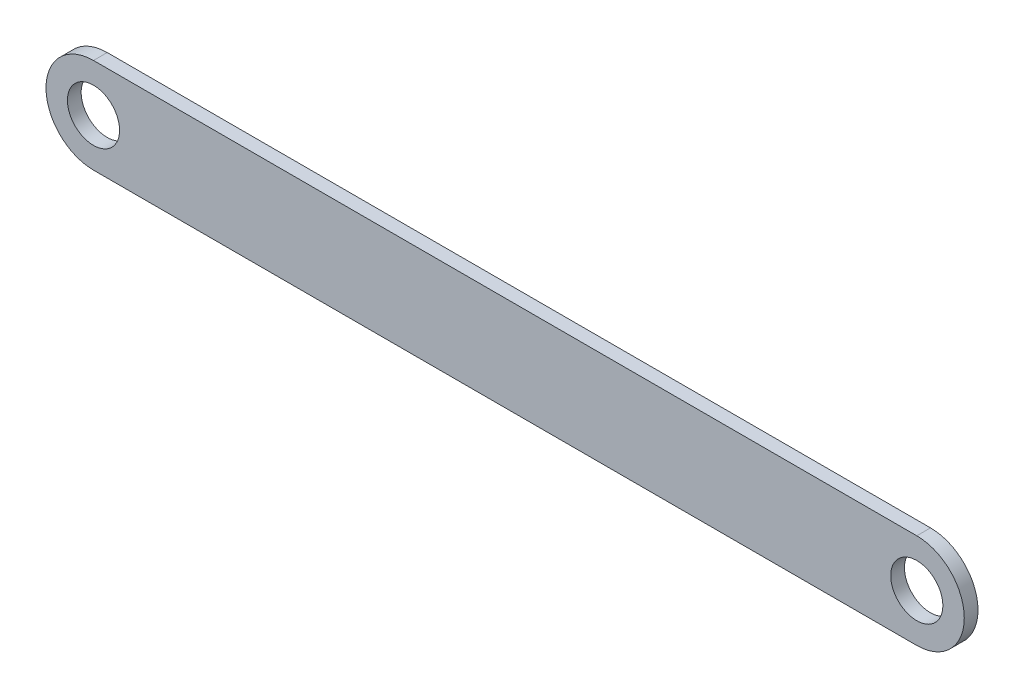
ISO-10303-21;
HEADER;
FILE_DESCRIPTION(('STEP AP214'),'2;1');
FILE_NAME('part.step','',(''),(''),'','','');
FILE_SCHEMA(('AUTOMOTIVE_DESIGN { 1 0 10303 214 1 1 1 1 }'));
ENDSEC;
DATA;
#1=APPLICATION_CONTEXT('core data for automotive mechanical design processes');
#2=APPLICATION_PROTOCOL_DEFINITION('international standard','automotive_design',2000,#1);
#3=PRODUCT_CONTEXT('',#1,'mechanical');
#4=PRODUCT('Part','Part','',(#3));
#5=PRODUCT_RELATED_PRODUCT_CATEGORY('part','',(#4));
#6=PRODUCT_DEFINITION_FORMATION('','',#4);
#7=PRODUCT_DEFINITION_CONTEXT('part definition',#1,'design');
#8=PRODUCT_DEFINITION('design','',#6,#7);
#9=PRODUCT_DEFINITION_SHAPE('','',#8);
#10=(LENGTH_UNIT() NAMED_UNIT(*) SI_UNIT(.MILLI.,.METRE.));
#11=(NAMED_UNIT(*) PLANE_ANGLE_UNIT() SI_UNIT($,.RADIAN.));
#12=(NAMED_UNIT(*) SI_UNIT($,.STERADIAN.) SOLID_ANGLE_UNIT());
#13=UNCERTAINTY_MEASURE_WITH_UNIT(LENGTH_MEASURE(1.E-05),#10,'distance_accuracy_value','');
#14=(GEOMETRIC_REPRESENTATION_CONTEXT(3) GLOBAL_UNCERTAINTY_ASSIGNED_CONTEXT((#13)) GLOBAL_UNIT_ASSIGNED_CONTEXT((#10,
#11,#12)) REPRESENTATION_CONTEXT('',''));
#15=CARTESIAN_POINT('',(0.,0.,0.));
#16=DIRECTION('',(0.,0.,1.));
#17=DIRECTION('',(1.,0.,0.));
#18=AXIS2_PLACEMENT_3D('',#15,#16,#17);
#19=CARTESIAN_POINT('',(-75.,0.,2.5));
#20=DIRECTION('',(0.,0.,-1.));
#21=DIRECTION('',(-1.,0.,0.));
#22=AXIS2_PLACEMENT_3D('',#19,#20,#21);
#23=CYLINDRICAL_SURFACE('',#22,8.65384615384615);
#24=CARTESIAN_POINT('',(-75.,0.,0.));
#25=DIRECTION('',(0.,0.,1.));
#26=DIRECTION('',(1.,0.,0.));
#27=AXIS2_PLACEMENT_3D('',#24,#25,#26);
#28=CIRCLE('',#27,8.65384615384615);
#29=CARTESIAN_POINT('',(-75.,8.65384615384615,0.));
#30=VERTEX_POINT('',#29);
#31=CARTESIAN_POINT('',(-75.,-8.65384615384615,0.));
#32=VERTEX_POINT('',#31);
#33=EDGE_CURVE('E107',#30,#32,#28,.T.);
#34=ORIENTED_EDGE('',*,*,#33,.T.);
#35=DIRECTION('',(0.,0.,-1.));
#36=VECTOR('',#35,1.);
#37=CARTESIAN_POINT('',(-75.,-8.65384615384615,2.5));
#38=LINE('',#37,#36);
#39=CARTESIAN_POINT('',(-75.,-8.65384615384615,2.5));
#40=VERTEX_POINT('',#39);
#41=EDGE_CURVE('E11',#40,#32,#38,.T.);
#42=ORIENTED_EDGE('',*,*,#41,.F.);
#43=CARTESIAN_POINT('',(-75.,0.,2.5));
#44=DIRECTION('',(0.,0.,1.));
#45=DIRECTION('',(1.,0.,0.));
#46=AXIS2_PLACEMENT_3D('',#43,#44,#45);
#47=CIRCLE('',#46,8.65384615384615);
#48=CARTESIAN_POINT('',(-75.,8.65384615384615,2.5));
#49=VERTEX_POINT('',#48);
#50=EDGE_CURVE('E91',#49,#40,#47,.T.);
#51=ORIENTED_EDGE('',*,*,#50,.F.);
#52=DIRECTION('',(0.,0.,-1.));
#53=VECTOR('',#52,1.);
#54=CARTESIAN_POINT('',(-75.,8.65384615384615,2.5));
#55=LINE('',#54,#53);
#56=EDGE_CURVE('E103',#49,#30,#55,.T.);
#57=ORIENTED_EDGE('',*,*,#56,.T.);
#58=EDGE_LOOP('',(#34,#42,#51,#57));
#59=FACE_BOUND('',#58,.T.);
#60=ADVANCED_FACE('F39',(#59),#23,.T.);
#61=CARTESIAN_POINT('',(-75.,-8.65384615384615,2.5));
#62=DIRECTION('',(0.,1.,0.));
#63=DIRECTION('',(-1.,0.,0.));
#64=AXIS2_PLACEMENT_3D('',#61,#62,#63);
#65=PLANE('',#64);
#66=DIRECTION('',(1.,0.,0.));
#67=VECTOR('',#66,1.);
#68=CARTESIAN_POINT('',(-75.,-8.65384615384615,0.));
#69=LINE('',#68,#67);
#70=CARTESIAN_POINT('',(75.,-8.65384615384612,0.));
#71=VERTEX_POINT('',#70);
#72=EDGE_CURVE('E96',#32,#71,#69,.T.);
#73=ORIENTED_EDGE('',*,*,#72,.T.);
#74=DIRECTION('',(0.,0.,-1.));
#75=VECTOR('',#74,1.);
#76=CARTESIAN_POINT('',(75.,-8.65384615384612,2.5));
#77=LINE('',#76,#75);
#78=CARTESIAN_POINT('',(75.,-8.65384615384612,2.5));
#79=VERTEX_POINT('',#78);
#80=EDGE_CURVE('E48',#79,#71,#77,.T.);
#81=ORIENTED_EDGE('',*,*,#80,.F.);
#82=DIRECTION('',(1.,0.,0.));
#83=VECTOR('',#82,1.);
#84=CARTESIAN_POINT('',(-75.,-8.65384615384615,2.5));
#85=LINE('',#84,#83);
#86=EDGE_CURVE('E86',#40,#79,#85,.T.);
#87=ORIENTED_EDGE('',*,*,#86,.F.);
#88=ORIENTED_EDGE('',*,*,#41,.T.);
#89=EDGE_LOOP('',(#73,#81,#87,#88));
#90=FACE_BOUND('',#89,.T.);
#91=ADVANCED_FACE('F95',(#90),#65,.F.);
#92=CARTESIAN_POINT('',(75.,0.,2.5));
#93=DIRECTION('',(0.,0.,-1.));
#94=DIRECTION('',(-1.,0.,0.));
#95=AXIS2_PLACEMENT_3D('',#92,#93,#94);
#96=CYLINDRICAL_SURFACE('',#95,8.65384615384615);
#97=CARTESIAN_POINT('',(75.,0.,0.));
#98=DIRECTION('',(0.,0.,1.));
#99=DIRECTION('',(1.,0.,0.));
#100=AXIS2_PLACEMENT_3D('',#97,#98,#99);
#101=CIRCLE('',#100,8.65384615384615);
#102=CARTESIAN_POINT('',(75.,8.65384615384618,0.));
#103=VERTEX_POINT('',#102);
#104=EDGE_CURVE('E73',#71,#103,#101,.T.);
#105=ORIENTED_EDGE('',*,*,#104,.T.);
#106=DIRECTION('',(0.,0.,-1.));
#107=VECTOR('',#106,1.);
#108=CARTESIAN_POINT('',(75.,8.65384615384618,2.5));
#109=LINE('',#108,#107);
#110=CARTESIAN_POINT('',(75.,8.65384615384618,2.5));
#111=VERTEX_POINT('',#110);
#112=EDGE_CURVE('E98',#111,#103,#109,.T.);
#113=ORIENTED_EDGE('',*,*,#112,.F.);
#114=CARTESIAN_POINT('',(75.,0.,2.5));
#115=DIRECTION('',(0.,0.,1.));
#116=DIRECTION('',(1.,0.,0.));
#117=AXIS2_PLACEMENT_3D('',#114,#115,#116);
#118=CIRCLE('',#117,8.65384615384615);
#119=EDGE_CURVE('E89',#79,#111,#118,.T.);
#120=ORIENTED_EDGE('',*,*,#119,.F.);
#121=ORIENTED_EDGE('',*,*,#80,.T.);
#122=EDGE_LOOP('',(#105,#113,#120,#121));
#123=FACE_BOUND('',#122,.T.);
#124=ADVANCED_FACE('F99',(#123),#96,.T.);
#125=CARTESIAN_POINT('',(-75.,8.65384615384615,2.5));
#126=DIRECTION('',(0.,-1.,0.));
#127=DIRECTION('',(1.,0.,0.));
#128=AXIS2_PLACEMENT_3D('',#125,#126,#127);
#129=PLANE('',#128);
#130=DIRECTION('',(-1.,0.,0.));
#131=VECTOR('',#130,1.);
#132=CARTESIAN_POINT('',(-75.,8.65384615384615,0.));
#133=LINE('',#132,#131);
#134=EDGE_CURVE('E79',#103,#30,#133,.T.);
#135=ORIENTED_EDGE('',*,*,#134,.T.);
#136=ORIENTED_EDGE('',*,*,#56,.F.);
#137=DIRECTION('',(-1.,0.,0.));
#138=VECTOR('',#137,1.);
#139=CARTESIAN_POINT('',(-75.,8.65384615384615,2.5));
#140=LINE('',#139,#138);
#141=EDGE_CURVE('E56',#111,#49,#140,.T.);
#142=ORIENTED_EDGE('',*,*,#141,.F.);
#143=ORIENTED_EDGE('',*,*,#112,.T.);
#144=EDGE_LOOP('',(#135,#136,#142,#143));
#145=FACE_BOUND('',#144,.T.);
#146=ADVANCED_FACE('F121',(#145),#129,.F.);
#147=CARTESIAN_POINT('',(-75.,0.,2.5));
#148=DIRECTION('',(0.,0.,1.));
#149=DIRECTION('',(1.,0.,0.));
#150=AXIS2_PLACEMENT_3D('',#147,#148,#149);
#151=PLANE('',#150);
#152=CARTESIAN_POINT('',(-75.,0.,2.5));
#153=DIRECTION('',(0.,0.,1.));
#154=DIRECTION('',(1.,0.,0.));
#155=AXIS2_PLACEMENT_3D('',#152,#153,#154);
#156=CIRCLE('',#155,4.75);
#157=CARTESIAN_POINT('',(-70.25,0.,2.5));
#158=VERTEX_POINT('',#157);
#159=EDGE_CURVE('E136',#158,#158,#156,.T.);
#160=ORIENTED_EDGE('',*,*,#159,.F.);
#161=EDGE_LOOP('',(#160));
#162=FACE_BOUND('',#161,.T.);
#163=CARTESIAN_POINT('',(75.,0.,2.5));
#164=DIRECTION('',(0.,0.,1.));
#165=DIRECTION('',(1.,0.,0.));
#166=AXIS2_PLACEMENT_3D('',#163,#164,#165);
#167=CIRCLE('',#166,4.75);
#168=CARTESIAN_POINT('',(79.75,0.,2.5));
#169=VERTEX_POINT('',#168);
#170=EDGE_CURVE('E128',#169,#169,#167,.T.);
#171=ORIENTED_EDGE('',*,*,#170,.F.);
#172=EDGE_LOOP('',(#171));
#173=FACE_BOUND('',#172,.T.);
#174=ORIENTED_EDGE('',*,*,#50,.T.);
#175=ORIENTED_EDGE('',*,*,#86,.T.);
#176=ORIENTED_EDGE('',*,*,#119,.T.);
#177=ORIENTED_EDGE('',*,*,#141,.T.);
#178=EDGE_LOOP('',(#174,#175,#176,#177));
#179=FACE_BOUND('',#178,.T.);
#180=ADVANCED_FACE('F87',(#162,#173,#179),#151,.T.);
#181=CARTESIAN_POINT('',(-75.,0.,0.));
#182=DIRECTION('',(0.,0.,1.));
#183=DIRECTION('',(1.,0.,0.));
#184=AXIS2_PLACEMENT_3D('',#181,#182,#183);
#185=PLANE('',#184);
#186=CARTESIAN_POINT('',(-75.,0.,0.));
#187=DIRECTION('',(0.,0.,1.));
#188=DIRECTION('',(1.,0.,0.));
#189=AXIS2_PLACEMENT_3D('',#186,#187,#188);
#190=CIRCLE('',#189,4.75);
#191=CARTESIAN_POINT('',(-70.25,0.,0.));
#192=VERTEX_POINT('',#191);
#193=EDGE_CURVE('E111',#192,#192,#190,.T.);
#194=ORIENTED_EDGE('',*,*,#193,.T.);
#195=EDGE_LOOP('',(#194));
#196=FACE_BOUND('',#195,.T.);
#197=CARTESIAN_POINT('',(75.,0.,0.));
#198=DIRECTION('',(0.,0.,1.));
#199=DIRECTION('',(1.,0.,0.));
#200=AXIS2_PLACEMENT_3D('',#197,#198,#199);
#201=CIRCLE('',#200,4.75);
#202=CARTESIAN_POINT('',(79.75,0.,0.));
#203=VERTEX_POINT('',#202);
#204=EDGE_CURVE('E132',#203,#203,#201,.T.);
#205=ORIENTED_EDGE('',*,*,#204,.T.);
#206=EDGE_LOOP('',(#205));
#207=FACE_BOUND('',#206,.T.);
#208=ORIENTED_EDGE('',*,*,#33,.F.);
#209=ORIENTED_EDGE('',*,*,#134,.F.);
#210=ORIENTED_EDGE('',*,*,#104,.F.);
#211=ORIENTED_EDGE('',*,*,#72,.F.);
#212=EDGE_LOOP('',(#208,#209,#210,#211));
#213=FACE_BOUND('',#212,.T.);
#214=ADVANCED_FACE('F124',(#196,#207,#213),#185,.F.);
#215=CARTESIAN_POINT('',(75.,0.,0.));
#216=DIRECTION('',(0.,0.,1.));
#217=DIRECTION('',(1.,0.,0.));
#218=AXIS2_PLACEMENT_3D('',#215,#216,#217);
#219=CYLINDRICAL_SURFACE('',#218,4.75);
#220=ORIENTED_EDGE('',*,*,#204,.F.);
#221=EDGE_LOOP('',(#220));
#222=FACE_BOUND('',#221,.T.);
#223=ORIENTED_EDGE('',*,*,#170,.T.);
#224=EDGE_LOOP('',(#223));
#225=FACE_BOUND('',#224,.T.);
#226=ADVANCED_FACE('F149',(#222,#225),#219,.F.);
#227=CARTESIAN_POINT('',(-75.,0.,0.));
#228=DIRECTION('',(0.,0.,1.));
#229=DIRECTION('',(1.,0.,0.));
#230=AXIS2_PLACEMENT_3D('',#227,#228,#229);
#231=CYLINDRICAL_SURFACE('',#230,4.75);
#232=ORIENTED_EDGE('',*,*,#193,.F.);
#233=EDGE_LOOP('',(#232));
#234=FACE_BOUND('',#233,.T.);
#235=ORIENTED_EDGE('',*,*,#159,.T.);
#236=EDGE_LOOP('',(#235));
#237=FACE_BOUND('',#236,.T.);
#238=ADVANCED_FACE('F146',(#234,#237),#231,.F.);
#239=CLOSED_SHELL('',(#60,#91,#124,#146,#180,#214,#226,#238));
#240=MANIFOLD_SOLID_BREP('B2',#239);
#241=ADVANCED_BREP_SHAPE_REPRESENTATION('',(#18,#240),#14);
#242=SHAPE_DEFINITION_REPRESENTATION(#9,#241);
ENDSEC;
END-ISO-10303-21;
